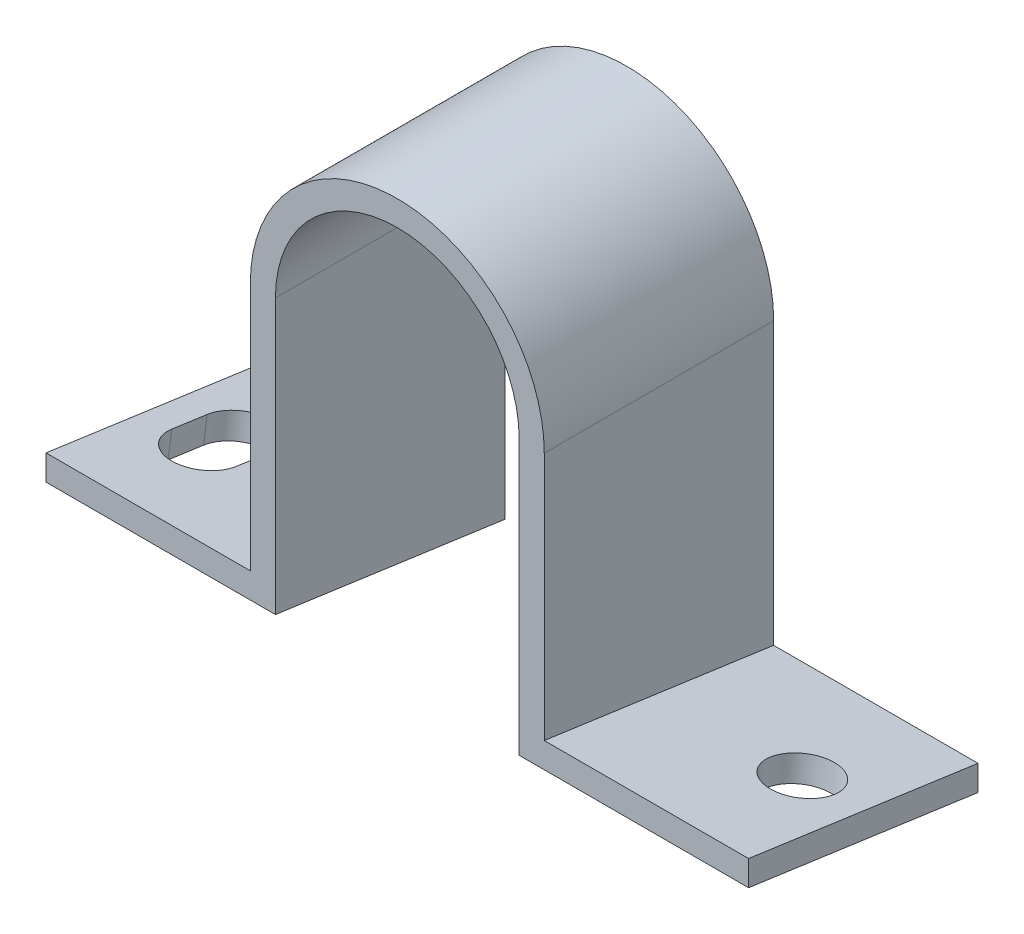
ISO-10303-21;
HEADER;
FILE_DESCRIPTION(('STEP AP214'),'2;1');
FILE_NAME('part.step','',(''),(''),'','','');
FILE_SCHEMA(('AUTOMOTIVE_DESIGN { 1 0 10303 214 1 1 1 1 }'));
ENDSEC;
DATA;
#1=APPLICATION_CONTEXT('core data for automotive mechanical design processes');
#2=APPLICATION_PROTOCOL_DEFINITION('international standard','automotive_design',2000,#1);
#3=PRODUCT_CONTEXT('',#1,'mechanical');
#4=PRODUCT('Part','Part','',(#3));
#5=PRODUCT_RELATED_PRODUCT_CATEGORY('part','',(#4));
#6=PRODUCT_DEFINITION_FORMATION('','',#4);
#7=PRODUCT_DEFINITION_CONTEXT('part definition',#1,'design');
#8=PRODUCT_DEFINITION('design','',#6,#7);
#9=PRODUCT_DEFINITION_SHAPE('','',#8);
#10=(LENGTH_UNIT() NAMED_UNIT(*) SI_UNIT(.MILLI.,.METRE.));
#11=(NAMED_UNIT(*) PLANE_ANGLE_UNIT() SI_UNIT($,.RADIAN.));
#12=(NAMED_UNIT(*) SI_UNIT($,.STERADIAN.) SOLID_ANGLE_UNIT());
#13=UNCERTAINTY_MEASURE_WITH_UNIT(LENGTH_MEASURE(1.E-05),#10,'distance_accuracy_value','');
#14=(GEOMETRIC_REPRESENTATION_CONTEXT(3) GLOBAL_UNCERTAINTY_ASSIGNED_CONTEXT((#13)) GLOBAL_UNIT_ASSIGNED_CONTEXT((#10,
#11,#12)) REPRESENTATION_CONTEXT('',''));
#15=CARTESIAN_POINT('',(0.,0.,0.));
#16=DIRECTION('',(0.,0.,1.));
#17=DIRECTION('',(1.,0.,0.));
#18=AXIS2_PLACEMENT_3D('',#15,#16,#17);
#19=CARTESIAN_POINT('',(-20.5,0.,16.));
#20=DIRECTION('',(1.,0.,0.));
#21=DIRECTION('',(0.,1.,0.));
#22=AXIS2_PLACEMENT_3D('',#19,#20,#21);
#23=PLANE('',#22);
#24=DIRECTION('',(0.,-0.139173100960058,-0.990268068741571));
#25=VECTOR('',#24,1.);
#26=CARTESIAN_POINT('',(-20.5,-39.214256851423,-16.));
#27=LINE('',#26,#25);
#28=CARTESIAN_POINT('',(-20.5,-34.7169501409467,16.));
#29=VERTEX_POINT('',#28);
#30=CARTESIAN_POINT('',(-20.5,-39.214256851423,-16.));
#31=VERTEX_POINT('',#30);
#32=EDGE_CURVE('E210',#29,#31,#27,.T.);
#33=ORIENTED_EDGE('',*,*,#32,.F.);
#34=DIRECTION('',(0.,-1.,0.));
#35=VECTOR('',#34,1.);
#36=CARTESIAN_POINT('',(-20.5,0.,16.));
#37=LINE('',#36,#35);
#38=CARTESIAN_POINT('',(-20.5,0.,16.));
#39=VERTEX_POINT('',#38);
#40=EDGE_CURVE('E250',#39,#29,#37,.T.);
#41=ORIENTED_EDGE('',*,*,#40,.F.);
#42=DIRECTION('',(0.,0.,-1.));
#43=VECTOR('',#42,1.);
#44=CARTESIAN_POINT('',(-20.5,0.,16.));
#45=LINE('',#44,#43);
#46=CARTESIAN_POINT('',(-20.5,0.,-16.));
#47=VERTEX_POINT('',#46);
#48=EDGE_CURVE('E270',#39,#47,#45,.T.);
#49=ORIENTED_EDGE('',*,*,#48,.T.);
#50=DIRECTION('',(0.,-1.,0.));
#51=VECTOR('',#50,1.);
#52=CARTESIAN_POINT('',(-20.5,0.,-16.));
#53=LINE('',#52,#51);
#54=EDGE_CURVE('E265',#47,#31,#53,.T.);
#55=ORIENTED_EDGE('',*,*,#54,.T.);
#56=EDGE_LOOP('',(#33,#41,#49,#55));
#57=FACE_BOUND('',#56,.T.);
#58=ADVANCED_FACE('F34',(#57),#23,.F.);
#59=CARTESIAN_POINT('',(0.,0.,16.));
#60=DIRECTION('',(0.,0.,-1.));
#61=DIRECTION('',(-1.,0.,0.));
#62=AXIS2_PLACEMENT_3D('',#59,#60,#61);
#63=CYLINDRICAL_SURFACE('',#62,17.);
#64=CARTESIAN_POINT('',(0.,0.,-16.));
#65=DIRECTION('',(0.,0.,-1.));
#66=DIRECTION('',(1.,0.,0.));
#67=AXIS2_PLACEMENT_3D('',#64,#65,#66);
#68=CIRCLE('',#67,17.);
#69=CARTESIAN_POINT('',(-17.,0.,-16.));
#70=VERTEX_POINT('',#69);
#71=CARTESIAN_POINT('',(17.,0.,-16.));
#72=VERTEX_POINT('',#71);
#73=EDGE_CURVE('E238',#70,#72,#68,.T.);
#74=ORIENTED_EDGE('',*,*,#73,.T.);
#75=DIRECTION('',(0.,0.,-1.));
#76=VECTOR('',#75,1.);
#77=CARTESIAN_POINT('',(17.,0.,16.));
#78=LINE('',#77,#76);
#79=CARTESIAN_POINT('',(17.,0.,16.));
#80=VERTEX_POINT('',#79);
#81=EDGE_CURVE('E275',#80,#72,#78,.T.);
#82=ORIENTED_EDGE('',*,*,#81,.F.);
#83=CARTESIAN_POINT('',(0.,0.,16.));
#84=DIRECTION('',(0.,0.,-1.));
#85=DIRECTION('',(1.,0.,0.));
#86=AXIS2_PLACEMENT_3D('',#83,#84,#85);
#87=CIRCLE('',#86,17.);
#88=CARTESIAN_POINT('',(-17.,0.,16.));
#89=VERTEX_POINT('',#88);
#90=EDGE_CURVE('E239',#89,#80,#87,.T.);
#91=ORIENTED_EDGE('',*,*,#90,.F.);
#92=DIRECTION('',(0.,0.,-1.));
#93=VECTOR('',#92,1.);
#94=CARTESIAN_POINT('',(-17.,0.,16.));
#95=LINE('',#94,#93);
#96=EDGE_CURVE('E255',#89,#70,#95,.T.);
#97=ORIENTED_EDGE('',*,*,#96,.T.);
#98=EDGE_LOOP('',(#74,#82,#91,#97));
#99=FACE_BOUND('',#98,.T.);
#100=ADVANCED_FACE('F36',(#99),#63,.F.);
#101=CARTESIAN_POINT('',(17.,0.,16.));
#102=DIRECTION('',(1.,0.,0.));
#103=DIRECTION('',(0.,1.,0.));
#104=AXIS2_PLACEMENT_3D('',#101,#102,#103);
#105=PLANE('',#104);
#106=DIRECTION('',(0.,-1.,0.));
#107=VECTOR('',#106,1.);
#108=CARTESIAN_POINT('',(17.,0.,-16.));
#109=LINE('',#108,#107);
#110=CARTESIAN_POINT('',(17.,-42.7486533552381,-16.));
#111=VERTEX_POINT('',#110);
#112=EDGE_CURVE('E258',#72,#111,#109,.T.);
#113=ORIENTED_EDGE('',*,*,#112,.T.);
#114=DIRECTION('',(0.,0.139173100960058,0.990268068741571));
#115=VECTOR('',#114,1.);
#116=CARTESIAN_POINT('',(17.,-37.5104504962152,21.2717500228005));
#117=LINE('',#116,#115);
#118=CARTESIAN_POINT('',(17.,-38.2513466447619,16.));
#119=VERTEX_POINT('',#118);
#120=EDGE_CURVE('E235',#111,#119,#117,.T.);
#121=ORIENTED_EDGE('',*,*,#120,.T.);
#122=DIRECTION('',(0.,-1.,0.));
#123=VECTOR('',#122,1.);
#124=CARTESIAN_POINT('',(17.,0.,16.));
#125=LINE('',#124,#123);
#126=EDGE_CURVE('E242',#80,#119,#125,.T.);
#127=ORIENTED_EDGE('',*,*,#126,.F.);
#128=ORIENTED_EDGE('',*,*,#81,.T.);
#129=EDGE_LOOP('',(#113,#121,#127,#128));
#130=FACE_BOUND('',#129,.T.);
#131=ADVANCED_FACE('F319',(#130),#105,.F.);
#132=CARTESIAN_POINT('',(20.5,0.,16.));
#133=DIRECTION('',(-1.,0.,0.));
#134=DIRECTION('',(0.,-1.,0.));
#135=AXIS2_PLACEMENT_3D('',#132,#133,#134);
#136=PLANE('',#135);
#137=DIRECTION('',(0.,1.,0.));
#138=VECTOR('',#137,1.);
#139=CARTESIAN_POINT('',(20.5,0.,16.));
#140=LINE('',#139,#138);
#141=CARTESIAN_POINT('',(20.5,-34.7169501409467,16.));
#142=VERTEX_POINT('',#141);
#143=CARTESIAN_POINT('',(20.5,0.,16.));
#144=VERTEX_POINT('',#143);
#145=EDGE_CURVE('E246',#142,#144,#140,.T.);
#146=ORIENTED_EDGE('',*,*,#145,.F.);
#147=DIRECTION('',(0.,-0.139173100960058,-0.990268068741571));
#148=VECTOR('',#147,1.);
#149=CARTESIAN_POINT('',(20.5,-39.214256851423,-16.));
#150=LINE('',#149,#148);
#151=CARTESIAN_POINT('',(20.5,-39.214256851423,-16.));
#152=VERTEX_POINT('',#151);
#153=EDGE_CURVE('E190',#142,#152,#150,.T.);
#154=ORIENTED_EDGE('',*,*,#153,.T.);
#155=DIRECTION('',(0.,1.,0.));
#156=VECTOR('',#155,1.);
#157=CARTESIAN_POINT('',(20.5,0.,-16.));
#158=LINE('',#157,#156);
#159=CARTESIAN_POINT('',(20.5,0.,-16.));
#160=VERTEX_POINT('',#159);
#161=EDGE_CURVE('E261',#152,#160,#158,.T.);
#162=ORIENTED_EDGE('',*,*,#161,.T.);
#163=DIRECTION('',(0.,0.,-1.));
#164=VECTOR('',#163,1.);
#165=CARTESIAN_POINT('',(20.5,0.,16.));
#166=LINE('',#165,#164);
#167=EDGE_CURVE('E273',#144,#160,#166,.T.);
#168=ORIENTED_EDGE('',*,*,#167,.F.);
#169=EDGE_LOOP('',(#146,#154,#162,#168));
#170=FACE_BOUND('',#169,.T.);
#171=ADVANCED_FACE('F305',(#170),#136,.F.);
#172=CARTESIAN_POINT('',(0.,0.,16.));
#173=DIRECTION('',(0.,0.,-1.));
#174=DIRECTION('',(-1.,0.,0.));
#175=AXIS2_PLACEMENT_3D('',#172,#173,#174);
#176=CYLINDRICAL_SURFACE('',#175,20.5);
#177=CARTESIAN_POINT('',(0.,0.,-16.));
#178=DIRECTION('',(0.,0.,1.));
#179=DIRECTION('',(1.,0.,0.));
#180=AXIS2_PLACEMENT_3D('',#177,#178,#179);
#181=CIRCLE('',#180,20.5);
#182=EDGE_CURVE('E263',#160,#47,#181,.T.);
#183=ORIENTED_EDGE('',*,*,#182,.T.);
#184=ORIENTED_EDGE('',*,*,#48,.F.);
#185=CARTESIAN_POINT('',(0.,0.,16.));
#186=DIRECTION('',(0.,0.,1.));
#187=DIRECTION('',(1.,0.,0.));
#188=AXIS2_PLACEMENT_3D('',#185,#186,#187);
#189=CIRCLE('',#188,20.5);
#190=EDGE_CURVE('E248',#144,#39,#189,.T.);
#191=ORIENTED_EDGE('',*,*,#190,.F.);
#192=ORIENTED_EDGE('',*,*,#167,.T.);
#193=EDGE_LOOP('',(#183,#184,#191,#192));
#194=FACE_BOUND('',#193,.T.);
#195=ADVANCED_FACE('F302',(#194),#176,.T.);
#196=CARTESIAN_POINT('',(-17.,0.,16.));
#197=DIRECTION('',(-1.,0.,0.));
#198=DIRECTION('',(0.,-1.,0.));
#199=AXIS2_PLACEMENT_3D('',#196,#197,#198);
#200=PLANE('',#199);
#201=DIRECTION('',(0.,1.,0.));
#202=VECTOR('',#201,1.);
#203=CARTESIAN_POINT('',(-17.,0.,16.));
#204=LINE('',#203,#202);
#205=CARTESIAN_POINT('',(-17.,-38.2513466447619,16.));
#206=VERTEX_POINT('',#205);
#207=EDGE_CURVE('E253',#206,#89,#204,.T.);
#208=ORIENTED_EDGE('',*,*,#207,.F.);
#209=DIRECTION('',(0.,-0.139173100960058,-0.990268068741571));
#210=VECTOR('',#209,1.);
#211=CARTESIAN_POINT('',(-17.,-37.5104504962152,21.2717500228005));
#212=LINE('',#211,#210);
#213=CARTESIAN_POINT('',(-17.,-42.7486533552382,-16.));
#214=VERTEX_POINT('',#213);
#215=EDGE_CURVE('E232',#206,#214,#212,.T.);
#216=ORIENTED_EDGE('',*,*,#215,.T.);
#217=DIRECTION('',(0.,1.,0.));
#218=VECTOR('',#217,1.);
#219=CARTESIAN_POINT('',(-17.,0.,-16.));
#220=LINE('',#219,#218);
#221=EDGE_CURVE('E243',#214,#70,#220,.T.);
#222=ORIENTED_EDGE('',*,*,#221,.T.);
#223=ORIENTED_EDGE('',*,*,#96,.F.);
#224=EDGE_LOOP('',(#208,#216,#222,#223));
#225=FACE_BOUND('',#224,.T.);
#226=ADVANCED_FACE('F325',(#225),#200,.F.);
#227=CARTESIAN_POINT('',(0.,0.,16.));
#228=DIRECTION('',(0.,0.,1.));
#229=DIRECTION('',(1.,0.,0.));
#230=AXIS2_PLACEMENT_3D('',#227,#228,#229);
#231=PLANE('',#230);
#232=DIRECTION('',(1.,0.,0.));
#233=VECTOR('',#232,1.);
#234=CARTESIAN_POINT('',(-50.,-38.2513466447619,16.));
#235=LINE('',#234,#233);
#236=CARTESIAN_POINT('',(49.,-38.2513466447619,16.));
#237=VERTEX_POINT('',#236);
#238=EDGE_CURVE('E229',#119,#237,#235,.T.);
#239=ORIENTED_EDGE('',*,*,#238,.T.);
#240=DIRECTION('',(0.,1.,0.));
#241=VECTOR('',#240,1.);
#242=CARTESIAN_POINT('',(49.,-38.2513466447619,16.));
#243=LINE('',#242,#241);
#244=CARTESIAN_POINT('',(49.,-34.7169501409467,16.));
#245=VERTEX_POINT('',#244);
#246=EDGE_CURVE('E197',#237,#245,#243,.T.);
#247=ORIENTED_EDGE('',*,*,#246,.T.);
#248=DIRECTION('',(-1.,0.,0.));
#249=VECTOR('',#248,1.);
#250=CARTESIAN_POINT('',(49.,-34.7169501409467,16.));
#251=LINE('',#250,#249);
#252=EDGE_CURVE('E203',#245,#142,#251,.T.);
#253=ORIENTED_EDGE('',*,*,#252,.T.);
#254=ORIENTED_EDGE('',*,*,#145,.T.);
#255=ORIENTED_EDGE('',*,*,#190,.T.);
#256=ORIENTED_EDGE('',*,*,#40,.T.);
#257=DIRECTION('',(1.,0.,0.));
#258=VECTOR('',#257,1.);
#259=CARTESIAN_POINT('',(-49.,-34.7169501409467,16.));
#260=LINE('',#259,#258);
#261=CARTESIAN_POINT('',(-49.,-34.7169501409467,16.));
#262=VERTEX_POINT('',#261);
#263=EDGE_CURVE('E226',#262,#29,#260,.T.);
#264=ORIENTED_EDGE('',*,*,#263,.F.);
#265=DIRECTION('',(0.,1.,0.));
#266=VECTOR('',#265,1.);
#267=CARTESIAN_POINT('',(-49.,-38.2513466447619,16.));
#268=LINE('',#267,#266);
#269=CARTESIAN_POINT('',(-49.,-38.2513466447619,16.));
#270=VERTEX_POINT('',#269);
#271=EDGE_CURVE('E217',#270,#262,#268,.T.);
#272=ORIENTED_EDGE('',*,*,#271,.F.);
#273=EDGE_CURVE('E231',#270,#206,#235,.T.);
#274=ORIENTED_EDGE('',*,*,#273,.T.);
#275=ORIENTED_EDGE('',*,*,#207,.T.);
#276=ORIENTED_EDGE('',*,*,#90,.T.);
#277=ORIENTED_EDGE('',*,*,#126,.T.);
#278=EDGE_LOOP('',(#239,#247,#253,#254,#255,#256,#264,#272,#274,#275,#276,#277));
#279=FACE_BOUND('',#278,.T.);
#280=ADVANCED_FACE('F316',(#279),#231,.T.);
#281=CARTESIAN_POINT('',(0.,0.,-16.));
#282=DIRECTION('',(0.,0.,1.));
#283=DIRECTION('',(1.,0.,0.));
#284=AXIS2_PLACEMENT_3D('',#281,#282,#283);
#285=PLANE('',#284);
#286=ORIENTED_EDGE('',*,*,#161,.F.);
#287=DIRECTION('',(-1.,0.,0.));
#288=VECTOR('',#287,1.);
#289=CARTESIAN_POINT('',(49.,-39.214256851423,-16.));
#290=LINE('',#289,#288);
#291=CARTESIAN_POINT('',(49.,-39.214256851423,-16.));
#292=VERTEX_POINT('',#291);
#293=EDGE_CURVE('E207',#292,#152,#290,.T.);
#294=ORIENTED_EDGE('',*,*,#293,.F.);
#295=DIRECTION('',(0.,-1.,0.));
#296=VECTOR('',#295,1.);
#297=CARTESIAN_POINT('',(49.,-42.7486533552381,-16.));
#298=LINE('',#297,#296);
#299=CARTESIAN_POINT('',(49.,-42.7486533552381,-16.));
#300=VERTEX_POINT('',#299);
#301=EDGE_CURVE('E191',#292,#300,#298,.T.);
#302=ORIENTED_EDGE('',*,*,#301,.T.);
#303=DIRECTION('',(-1.,0.,0.));
#304=VECTOR('',#303,1.);
#305=CARTESIAN_POINT('',(0.,-42.7486533552382,-16.));
#306=LINE('',#305,#304);
#307=EDGE_CURVE('E11',#300,#111,#306,.T.);
#308=ORIENTED_EDGE('',*,*,#307,.T.);
#309=ORIENTED_EDGE('',*,*,#112,.F.);
#310=ORIENTED_EDGE('',*,*,#73,.F.);
#311=ORIENTED_EDGE('',*,*,#221,.F.);
#312=CARTESIAN_POINT('',(-49.,-42.7486533552381,-16.));
#313=VERTEX_POINT('',#312);
#314=EDGE_CURVE('E38',#214,#313,#306,.T.);
#315=ORIENTED_EDGE('',*,*,#314,.T.);
#316=DIRECTION('',(0.,-1.,0.));
#317=VECTOR('',#316,1.);
#318=CARTESIAN_POINT('',(-49.,-42.7486533552381,-16.));
#319=LINE('',#318,#317);
#320=CARTESIAN_POINT('',(-49.,-39.214256851423,-16.));
#321=VERTEX_POINT('',#320);
#322=EDGE_CURVE('E211',#321,#313,#319,.T.);
#323=ORIENTED_EDGE('',*,*,#322,.F.);
#324=DIRECTION('',(1.,0.,0.));
#325=VECTOR('',#324,1.);
#326=CARTESIAN_POINT('',(-49.,-39.214256851423,-16.));
#327=LINE('',#326,#325);
#328=EDGE_CURVE('E221',#321,#31,#327,.T.);
#329=ORIENTED_EDGE('',*,*,#328,.T.);
#330=ORIENTED_EDGE('',*,*,#54,.F.);
#331=ORIENTED_EDGE('',*,*,#182,.F.);
#332=EDGE_LOOP('',(#286,#294,#302,#308,#309,#310,#311,#315,#323,#329,#330,#331));
#333=FACE_BOUND('',#332,.T.);
#334=ADVANCED_FACE('F284',(#333),#285,.F.);
#335=CARTESIAN_POINT('',(-50.,-42.7486533552382,-16.));
#336=DIRECTION('',(0.,0.990268068741571,-0.139173100960058));
#337=DIRECTION('',(0.,0.139173100960058,0.990268068741571));
#338=AXIS2_PLACEMENT_3D('',#335,#336,#337);
#339=PLANE('',#338);
#340=DIRECTION('',(0.,-0.139173100960058,-0.990268068741571));
#341=VECTOR('',#340,1.);
#342=CARTESIAN_POINT('',(-36.,-42.7486533552382,-16.));
#343=LINE('',#342,#341);
#344=CARTESIAN_POINT('',(-36.,-40.0836089843802,2.96277602521414));
#345=VERTEX_POINT('',#344);
#346=CARTESIAN_POINT('',(-36.,-40.7794744891805,-1.98856431849372));
#347=VERTEX_POINT('',#346);
#348=EDGE_CURVE('E178',#345,#347,#343,.T.);
#349=ORIENTED_EDGE('',*,*,#348,.T.);
#350=CARTESIAN_POINT('',(-40.5,-40.7794744891805,-1.98856431849372));
#351=DIRECTION('',(0.,0.990268068741571,-0.139173100960058));
#352=DIRECTION('',(0.,0.139173100960058,0.990268068741571));
#353=AXIS2_PLACEMENT_3D('',#350,#351,#352);
#354=CIRCLE('',#353,4.5);
#355=CARTESIAN_POINT('',(-45.,-40.7794744891805,-1.98856431849373));
#356=VERTEX_POINT('',#355);
#357=EDGE_CURVE('E181',#347,#356,#354,.T.);
#358=ORIENTED_EDGE('',*,*,#357,.T.);
#359=DIRECTION('',(0.,0.139173100960058,0.990268068741571));
#360=VECTOR('',#359,1.);
#361=CARTESIAN_POINT('',(-45.,-42.7486533552382,-16.));
#362=LINE('',#361,#360);
#363=CARTESIAN_POINT('',(-45.,-40.0836089843802,2.96277602521413));
#364=VERTEX_POINT('',#363);
#365=EDGE_CURVE('E173',#356,#364,#362,.T.);
#366=ORIENTED_EDGE('',*,*,#365,.T.);
#367=CARTESIAN_POINT('',(-40.5,-40.0836089843802,2.96277602521414));
#368=DIRECTION('',(0.,0.990268068741571,-0.139173100960058));
#369=DIRECTION('',(0.,0.139173100960058,0.990268068741571));
#370=AXIS2_PLACEMENT_3D('',#367,#368,#369);
#371=CIRCLE('',#370,4.5);
#372=EDGE_CURVE('E153',#364,#345,#371,.T.);
#373=ORIENTED_EDGE('',*,*,#372,.T.);
#374=EDGE_LOOP('',(#349,#358,#366,#373));
#375=FACE_BOUND('',#374,.T.);
#376=ORIENTED_EDGE('',*,*,#314,.F.);
#377=ORIENTED_EDGE('',*,*,#215,.F.);
#378=ORIENTED_EDGE('',*,*,#273,.F.);
#379=DIRECTION('',(0.,0.139173100960058,0.990268068741571));
#380=VECTOR('',#379,1.);
#381=CARTESIAN_POINT('',(-49.,-42.7486533552381,-16.));
#382=LINE('',#381,#380);
#383=EDGE_CURVE('E214',#313,#270,#382,.T.);
#384=ORIENTED_EDGE('',*,*,#383,.F.);
#385=EDGE_LOOP('',(#376,#377,#378,#384));
#386=FACE_BOUND('',#385,.T.);
#387=ADVANCED_FACE('F287',(#375,#386),#339,.F.);
#388=CARTESIAN_POINT('',(40.5,-40.4315417367803,0.487105853360194));
#389=DIRECTION('',(0.,0.990268068741571,-0.139173100960058));
#390=DIRECTION('',(0.,0.139173100960058,0.990268068741571));
#391=AXIS2_PLACEMENT_3D('',#388,#389,#390);
#392=CIRCLE('',#391,4.5);
#393=CARTESIAN_POINT('',(40.5,-39.8052627824601,4.94331216269726));
#394=VERTEX_POINT('',#393);
#395=EDGE_CURVE('E187',#394,#394,#392,.T.);
#396=ORIENTED_EDGE('',*,*,#395,.T.);
#397=EDGE_LOOP('',(#396));
#398=FACE_BOUND('',#397,.T.);
#399=ORIENTED_EDGE('',*,*,#307,.F.);
#400=DIRECTION('',(0.,0.139173100960058,0.990268068741571));
#401=VECTOR('',#400,1.);
#402=CARTESIAN_POINT('',(49.,-42.7486533552381,-16.));
#403=LINE('',#402,#401);
#404=EDGE_CURVE('E200',#300,#237,#403,.T.);
#405=ORIENTED_EDGE('',*,*,#404,.T.);
#406=ORIENTED_EDGE('',*,*,#238,.F.);
#407=ORIENTED_EDGE('',*,*,#120,.F.);
#408=EDGE_LOOP('',(#399,#405,#406,#407));
#409=FACE_BOUND('',#408,.T.);
#410=ADVANCED_FACE('F318',(#398,#409),#339,.F.);
#411=CARTESIAN_POINT('',(-49.,-39.214256851423,-16.));
#412=DIRECTION('',(0.,-0.990268068741571,0.139173100960058));
#413=DIRECTION('',(0.,-0.139173100960058,-0.990268068741571));
#414=AXIS2_PLACEMENT_3D('',#411,#412,#413);
#415=PLANE('',#414);
#416=DIRECTION('',(0.,0.139173100960059,0.990268068741571));
#417=VECTOR('',#416,1.);
#418=CARTESIAN_POINT('',(-45.,-37.313536248585,-2.47567017185393));
#419=LINE('',#418,#417);
#420=CARTESIAN_POINT('',(-45.,-37.313536248585,-2.47567017185393));
#421=VERTEX_POINT('',#420);
#422=CARTESIAN_POINT('',(-45.,-36.6176707437847,2.47567017185393));
#423=VERTEX_POINT('',#422);
#424=EDGE_CURVE('E159',#421,#423,#419,.T.);
#425=ORIENTED_EDGE('',*,*,#424,.F.);
#426=CARTESIAN_POINT('',(-40.5,-37.313536248585,-2.47567017185393));
#427=DIRECTION('',(0.,0.990268068741571,-0.139173100960058));
#428=DIRECTION('',(0.,0.139173100960058,0.990268068741571));
#429=AXIS2_PLACEMENT_3D('',#426,#427,#428);
#430=CIRCLE('',#429,4.5);
#431=CARTESIAN_POINT('',(-36.,-37.313536248585,-2.47567017185393));
#432=VERTEX_POINT('',#431);
#433=EDGE_CURVE('E57',#432,#421,#430,.T.);
#434=ORIENTED_EDGE('',*,*,#433,.F.);
#435=DIRECTION('',(0.,-0.139173100960058,-0.990268068741571));
#436=VECTOR('',#435,1.);
#437=CARTESIAN_POINT('',(-36.,-37.313536248585,-2.47567017185393));
#438=LINE('',#437,#436);
#439=CARTESIAN_POINT('',(-36.,-36.6176707437847,2.47567017185393));
#440=VERTEX_POINT('',#439);
#441=EDGE_CURVE('E166',#440,#432,#438,.T.);
#442=ORIENTED_EDGE('',*,*,#441,.F.);
#443=CARTESIAN_POINT('',(-40.5,-36.6176707437847,2.47567017185393));
#444=DIRECTION('',(0.,0.990268068741571,-0.139173100960058));
#445=DIRECTION('',(0.,0.139173100960058,0.990268068741571));
#446=AXIS2_PLACEMENT_3D('',#443,#444,#445);
#447=CIRCLE('',#446,4.5);
#448=EDGE_CURVE('E150',#423,#440,#447,.T.);
#449=ORIENTED_EDGE('',*,*,#448,.F.);
#450=EDGE_LOOP('',(#425,#434,#442,#449));
#451=FACE_BOUND('',#450,.T.);
#452=ORIENTED_EDGE('',*,*,#32,.T.);
#453=ORIENTED_EDGE('',*,*,#328,.F.);
#454=DIRECTION('',(0.,-0.139173100960058,-0.990268068741571));
#455=VECTOR('',#454,1.);
#456=CARTESIAN_POINT('',(-49.,-39.214256851423,-16.));
#457=LINE('',#456,#455);
#458=EDGE_CURVE('E219',#262,#321,#457,.T.);
#459=ORIENTED_EDGE('',*,*,#458,.F.);
#460=ORIENTED_EDGE('',*,*,#263,.T.);
#461=EDGE_LOOP('',(#452,#453,#459,#460));
#462=FACE_BOUND('',#461,.T.);
#463=ADVANCED_FACE('F163',(#451,#462),#415,.F.);
#464=CARTESIAN_POINT('',(-49.,0.,0.));
#465=DIRECTION('',(1.,0.,0.));
#466=DIRECTION('',(0.,0.,-1.));
#467=AXIS2_PLACEMENT_3D('',#464,#465,#466);
#468=PLANE('',#467);
#469=ORIENTED_EDGE('',*,*,#322,.T.);
#470=ORIENTED_EDGE('',*,*,#383,.T.);
#471=ORIENTED_EDGE('',*,*,#271,.T.);
#472=ORIENTED_EDGE('',*,*,#458,.T.);
#473=EDGE_LOOP('',(#469,#470,#471,#472));
#474=FACE_BOUND('',#473,.T.);
#475=ADVANCED_FACE('F291',(#474),#468,.F.);
#476=CARTESIAN_POINT('',(49.,-39.214256851423,-16.));
#477=DIRECTION('',(0.,0.990268068741571,-0.139173100960058));
#478=DIRECTION('',(0.,0.139173100960058,0.990268068741571));
#479=AXIS2_PLACEMENT_3D('',#476,#477,#478);
#480=PLANE('',#479);
#481=CARTESIAN_POINT('',(40.5,-36.9656034961848,0.));
#482=DIRECTION('',(0.,0.990268068741571,-0.139173100960058));
#483=DIRECTION('',(0.,0.139173100960058,0.990268068741571));
#484=AXIS2_PLACEMENT_3D('',#481,#482,#483);
#485=CIRCLE('',#484,4.5);
#486=CARTESIAN_POINT('',(40.5,-36.3393245418646,4.45620630933706));
#487=VERTEX_POINT('',#486);
#488=EDGE_CURVE('E184',#487,#487,#485,.T.);
#489=ORIENTED_EDGE('',*,*,#488,.F.);
#490=EDGE_LOOP('',(#489));
#491=FACE_BOUND('',#490,.T.);
#492=ORIENTED_EDGE('',*,*,#153,.F.);
#493=ORIENTED_EDGE('',*,*,#252,.F.);
#494=DIRECTION('',(0.,-0.139173100960058,-0.990268068741571));
#495=VECTOR('',#494,1.);
#496=CARTESIAN_POINT('',(49.,-39.214256851423,-16.));
#497=LINE('',#496,#495);
#498=EDGE_CURVE('E194',#245,#292,#497,.T.);
#499=ORIENTED_EDGE('',*,*,#498,.T.);
#500=ORIENTED_EDGE('',*,*,#293,.T.);
#501=EDGE_LOOP('',(#492,#493,#499,#500));
#502=FACE_BOUND('',#501,.T.);
#503=ADVANCED_FACE('F309',(#491,#502),#480,.T.);
#504=CARTESIAN_POINT('',(49.,0.,0.));
#505=DIRECTION('',(-1.,0.,0.));
#506=DIRECTION('',(0.,0.,-1.));
#507=AXIS2_PLACEMENT_3D('',#504,#505,#506);
#508=PLANE('',#507);
#509=ORIENTED_EDGE('',*,*,#301,.F.);
#510=ORIENTED_EDGE('',*,*,#498,.F.);
#511=ORIENTED_EDGE('',*,*,#246,.F.);
#512=ORIENTED_EDGE('',*,*,#404,.F.);
#513=EDGE_LOOP('',(#509,#510,#511,#512));
#514=FACE_BOUND('',#513,.T.);
#515=ADVANCED_FACE('F313',(#514),#508,.F.);
#516=CARTESIAN_POINT('',(40.5,-65.1882434553196,3.96643337736165));
#517=DIRECTION('',(0.,0.990268068741571,-0.139173100960058));
#518=DIRECTION('',(0.,0.139173100960058,0.990268068741571));
#519=AXIS2_PLACEMENT_3D('',#516,#517,#518);
#520=CYLINDRICAL_SURFACE('',#519,4.5);
#521=ORIENTED_EDGE('',*,*,#488,.T.);
#522=EDGE_LOOP('',(#521));
#523=FACE_BOUND('',#522,.T.);
#524=ORIENTED_EDGE('',*,*,#395,.F.);
#525=EDGE_LOOP('',(#524));
#526=FACE_BOUND('',#525,.T.);
#527=ADVANCED_FACE('F444',(#523,#526),#520,.F.);
#528=CARTESIAN_POINT('',(-40.5,-65.5361762077198,1.49076320550773));
#529=DIRECTION('',(0.,0.990268068741571,-0.139173100960058));
#530=DIRECTION('',(0.,0.139173100960058,0.990268068741571));
#531=AXIS2_PLACEMENT_3D('',#528,#529,#530);
#532=CYLINDRICAL_SURFACE('',#531,4.5);
#533=DIRECTION('',(0.,0.990268068741571,-0.139173100960058));
#534=VECTOR('',#533,1.);
#535=CARTESIAN_POINT('',(-36.,-65.5361762077198,1.49076320550773));
#536=LINE('',#535,#534);
#537=EDGE_CURVE('E171',#347,#432,#536,.T.);
#538=ORIENTED_EDGE('',*,*,#537,.T.);
#539=ORIENTED_EDGE('',*,*,#433,.T.);
#540=DIRECTION('',(0.,0.990268068741571,-0.139173100960058));
#541=VECTOR('',#540,1.);
#542=CARTESIAN_POINT('',(-45.,-65.5361762077198,1.49076320550773));
#543=LINE('',#542,#541);
#544=EDGE_CURVE('E156',#356,#421,#543,.T.);
#545=ORIENTED_EDGE('',*,*,#544,.F.);
#546=ORIENTED_EDGE('',*,*,#357,.F.);
#547=EDGE_LOOP('',(#538,#539,#545,#546));
#548=FACE_BOUND('',#547,.T.);
#549=ADVANCED_FACE('F449',(#548),#532,.F.);
#550=CARTESIAN_POINT('',(-36.,-65.5361762077198,1.49076320550773));
#551=DIRECTION('',(1.,0.,0.));
#552=DIRECTION('',(0.,1.,0.));
#553=AXIS2_PLACEMENT_3D('',#550,#551,#552);
#554=PLANE('',#553);
#555=DIRECTION('',(0.,0.990268068741571,-0.139173100960058));
#556=VECTOR('',#555,1.);
#557=CARTESIAN_POINT('',(-36.,-64.8403107029195,6.44210354921559));
#558=LINE('',#557,#556);
#559=EDGE_CURVE('E155',#345,#440,#558,.T.);
#560=ORIENTED_EDGE('',*,*,#559,.T.);
#561=ORIENTED_EDGE('',*,*,#441,.T.);
#562=ORIENTED_EDGE('',*,*,#537,.F.);
#563=ORIENTED_EDGE('',*,*,#348,.F.);
#564=EDGE_LOOP('',(#560,#561,#562,#563));
#565=FACE_BOUND('',#564,.T.);
#566=ADVANCED_FACE('F457',(#565),#554,.F.);
#567=CARTESIAN_POINT('',(-40.5,-64.8403107029195,6.44210354921559));
#568=DIRECTION('',(0.,0.990268068741571,-0.139173100960058));
#569=DIRECTION('',(0.,0.139173100960058,0.990268068741571));
#570=AXIS2_PLACEMENT_3D('',#567,#568,#569);
#571=CYLINDRICAL_SURFACE('',#570,4.5);
#572=DIRECTION('',(0.,0.990268068741571,-0.139173100960058));
#573=VECTOR('',#572,1.);
#574=CARTESIAN_POINT('',(-45.,-64.8403107029195,6.44210354921559));
#575=LINE('',#574,#573);
#576=EDGE_CURVE('E49',#364,#423,#575,.T.);
#577=ORIENTED_EDGE('',*,*,#576,.T.);
#578=ORIENTED_EDGE('',*,*,#448,.T.);
#579=ORIENTED_EDGE('',*,*,#559,.F.);
#580=ORIENTED_EDGE('',*,*,#372,.F.);
#581=EDGE_LOOP('',(#577,#578,#579,#580));
#582=FACE_BOUND('',#581,.T.);
#583=ADVANCED_FACE('F147',(#582),#571,.F.);
#584=CARTESIAN_POINT('',(-45.,-65.5361762077198,1.49076320550773));
#585=DIRECTION('',(-1.,0.,0.));
#586=DIRECTION('',(0.,-1.,0.));
#587=AXIS2_PLACEMENT_3D('',#584,#585,#586);
#588=PLANE('',#587);
#589=ORIENTED_EDGE('',*,*,#544,.T.);
#590=ORIENTED_EDGE('',*,*,#424,.T.);
#591=ORIENTED_EDGE('',*,*,#576,.F.);
#592=ORIENTED_EDGE('',*,*,#365,.F.);
#593=EDGE_LOOP('',(#589,#590,#591,#592));
#594=FACE_BOUND('',#593,.T.);
#595=ADVANCED_FACE('F160',(#594),#588,.F.);
#596=CLOSED_SHELL('',(#58,#100,#131,#171,#195,#226,#280,#334,#387,#410,#463,#475,#503,#515,#527,
#549,#566,#583,#595));
#597=MANIFOLD_SOLID_BREP('B2',#596);
#598=ADVANCED_BREP_SHAPE_REPRESENTATION('',(#18,#597),#14);
#599=SHAPE_DEFINITION_REPRESENTATION(#9,#598);
ENDSEC;
END-ISO-10303-21;
